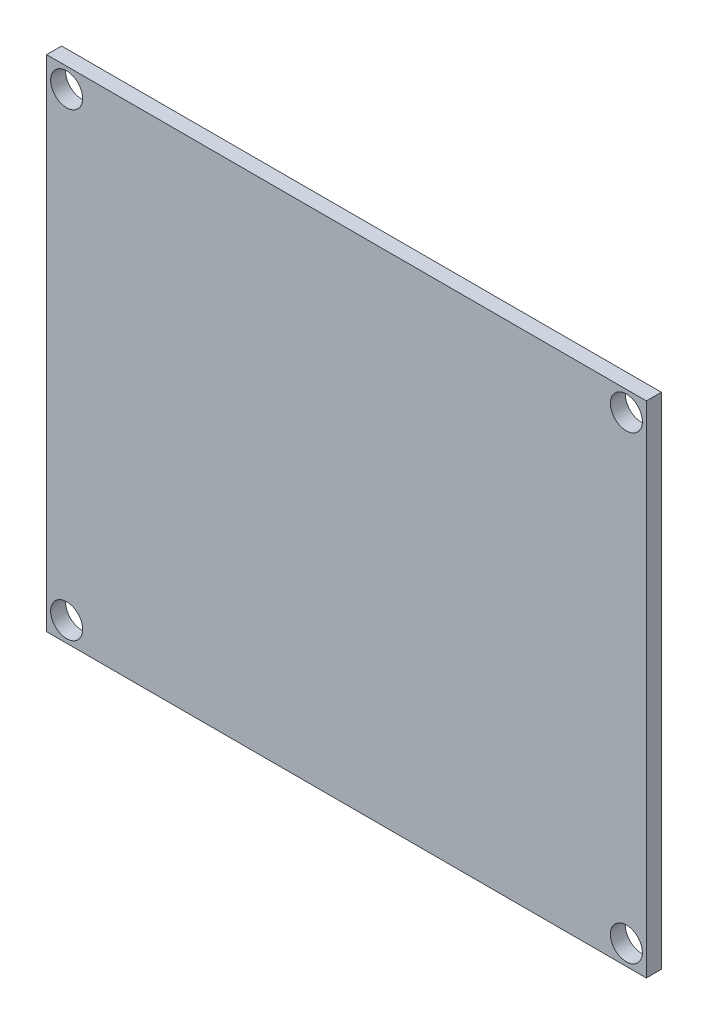
ISO-10303-21;
HEADER;
FILE_DESCRIPTION(('STEP AP214'),'2;1');
FILE_NAME('part.step','',(''),(''),'','','');
FILE_SCHEMA(('AUTOMOTIVE_DESIGN { 1 0 10303 214 1 1 1 1 }'));
ENDSEC;
DATA;
#1=APPLICATION_CONTEXT('core data for automotive mechanical design processes');
#2=APPLICATION_PROTOCOL_DEFINITION('international standard','automotive_design',2000,#1);
#3=PRODUCT_CONTEXT('',#1,'mechanical');
#4=PRODUCT('Part','Part','',(#3));
#5=PRODUCT_RELATED_PRODUCT_CATEGORY('part','',(#4));
#6=PRODUCT_DEFINITION_FORMATION('','',#4);
#7=PRODUCT_DEFINITION_CONTEXT('part definition',#1,'design');
#8=PRODUCT_DEFINITION('design','',#6,#7);
#9=PRODUCT_DEFINITION_SHAPE('','',#8);
#10=(LENGTH_UNIT() NAMED_UNIT(*) SI_UNIT(.MILLI.,.METRE.));
#11=(NAMED_UNIT(*) PLANE_ANGLE_UNIT() SI_UNIT($,.RADIAN.));
#12=(NAMED_UNIT(*) SI_UNIT($,.STERADIAN.) SOLID_ANGLE_UNIT());
#13=UNCERTAINTY_MEASURE_WITH_UNIT(LENGTH_MEASURE(1.E-05),#10,'distance_accuracy_value','');
#14=(GEOMETRIC_REPRESENTATION_CONTEXT(3) GLOBAL_UNCERTAINTY_ASSIGNED_CONTEXT((#13)) GLOBAL_UNIT_ASSIGNED_CONTEXT((#10,
#11,#12)) REPRESENTATION_CONTEXT('',''));
#15=CARTESIAN_POINT('',(0.,0.,0.));
#16=DIRECTION('',(0.,0.,1.));
#17=DIRECTION('',(1.,0.,0.));
#18=AXIS2_PLACEMENT_3D('',#15,#16,#17);
#19=CARTESIAN_POINT('',(0.,0.,1.5));
#20=DIRECTION('',(0.,0.,-1.));
#21=DIRECTION('',(-1.,0.,0.));
#22=AXIS2_PLACEMENT_3D('',#19,#20,#21);
#23=PLANE('',#22);
#24=DIRECTION('',(0.,1.,0.));
#25=VECTOR('',#24,1.);
#26=CARTESIAN_POINT('',(30.,-25.,1.5));
#27=LINE('',#26,#25);
#28=CARTESIAN_POINT('',(30.,-25.,1.5));
#29=VERTEX_POINT('',#28);
#30=CARTESIAN_POINT('',(30.,25.,1.5));
#31=VERTEX_POINT('',#30);
#32=EDGE_CURVE('E86',#29,#31,#27,.T.);
#33=ORIENTED_EDGE('',*,*,#32,.T.);
#34=DIRECTION('',(-1.,0.,0.));
#35=VECTOR('',#34,1.);
#36=CARTESIAN_POINT('',(-30.,25.,1.5));
#37=LINE('',#36,#35);
#38=CARTESIAN_POINT('',(-30.,25.,1.5));
#39=VERTEX_POINT('',#38);
#40=EDGE_CURVE('E81',#31,#39,#37,.T.);
#41=ORIENTED_EDGE('',*,*,#40,.T.);
#42=DIRECTION('',(0.,-1.,0.));
#43=VECTOR('',#42,1.);
#44=CARTESIAN_POINT('',(-30.,-25.,1.5));
#45=LINE('',#44,#43);
#46=CARTESIAN_POINT('',(-30.,-25.,1.5));
#47=VERTEX_POINT('',#46);
#48=EDGE_CURVE('E84',#39,#47,#45,.T.);
#49=ORIENTED_EDGE('',*,*,#48,.T.);
#50=DIRECTION('',(1.,0.,0.));
#51=VECTOR('',#50,1.);
#52=CARTESIAN_POINT('',(-30.,-25.,1.5));
#53=LINE('',#52,#51);
#54=EDGE_CURVE('E51',#47,#29,#53,.T.);
#55=ORIENTED_EDGE('',*,*,#54,.T.);
#56=EDGE_LOOP('',(#33,#41,#49,#55));
#57=FACE_BOUND('',#56,.T.);
#58=CARTESIAN_POINT('',(28.,23.,1.5));
#59=DIRECTION('',(0.,0.,1.));
#60=DIRECTION('',(1.,0.,0.));
#61=AXIS2_PLACEMENT_3D('',#58,#59,#60);
#62=CIRCLE('',#61,1.6);
#63=CARTESIAN_POINT('',(29.6,23.,1.5));
#64=VERTEX_POINT('',#63);
#65=EDGE_CURVE('E101',#64,#64,#62,.T.);
#66=ORIENTED_EDGE('',*,*,#65,.F.);
#67=EDGE_LOOP('',(#66));
#68=FACE_BOUND('',#67,.T.);
#69=CARTESIAN_POINT('',(28.,-23.,1.5));
#70=DIRECTION('',(0.,0.,1.));
#71=DIRECTION('',(1.,0.,0.));
#72=AXIS2_PLACEMENT_3D('',#69,#70,#71);
#73=CIRCLE('',#72,1.6);
#74=CARTESIAN_POINT('',(29.6,-23.,1.5));
#75=VERTEX_POINT('',#74);
#76=EDGE_CURVE('E116',#75,#75,#73,.T.);
#77=ORIENTED_EDGE('',*,*,#76,.F.);
#78=EDGE_LOOP('',(#77));
#79=FACE_BOUND('',#78,.T.);
#80=CARTESIAN_POINT('',(-28.,23.,1.5));
#81=DIRECTION('',(0.,0.,1.));
#82=DIRECTION('',(1.,0.,0.));
#83=AXIS2_PLACEMENT_3D('',#80,#81,#82);
#84=CIRCLE('',#83,1.6);
#85=CARTESIAN_POINT('',(-26.4,23.,1.5));
#86=VERTEX_POINT('',#85);
#87=EDGE_CURVE('E122',#86,#86,#84,.T.);
#88=ORIENTED_EDGE('',*,*,#87,.F.);
#89=EDGE_LOOP('',(#88));
#90=FACE_BOUND('',#89,.T.);
#91=CARTESIAN_POINT('',(-28.,-23.,1.5));
#92=DIRECTION('',(0.,0.,1.));
#93=DIRECTION('',(1.,0.,0.));
#94=AXIS2_PLACEMENT_3D('',#91,#92,#93);
#95=CIRCLE('',#94,1.6);
#96=CARTESIAN_POINT('',(-26.4,-23.,1.5));
#97=VERTEX_POINT('',#96);
#98=EDGE_CURVE('E128',#97,#97,#95,.T.);
#99=ORIENTED_EDGE('',*,*,#98,.F.);
#100=EDGE_LOOP('',(#99));
#101=FACE_BOUND('',#100,.T.);
#102=ADVANCED_FACE('F34',(#57,#68,#79,#90,#101),#23,.F.);
#103=CARTESIAN_POINT('',(0.,0.,0.));
#104=DIRECTION('',(0.,0.,-1.));
#105=DIRECTION('',(-1.,0.,0.));
#106=AXIS2_PLACEMENT_3D('',#103,#104,#105);
#107=PLANE('',#106);
#108=CARTESIAN_POINT('',(-28.,23.,0.));
#109=DIRECTION('',(0.,0.,1.));
#110=DIRECTION('',(1.,0.,0.));
#111=AXIS2_PLACEMENT_3D('',#108,#109,#110);
#112=CIRCLE('',#111,1.6);
#113=CARTESIAN_POINT('',(-26.4,23.,0.));
#114=VERTEX_POINT('',#113);
#115=EDGE_CURVE('E125',#114,#114,#112,.T.);
#116=ORIENTED_EDGE('',*,*,#115,.T.);
#117=EDGE_LOOP('',(#116));
#118=FACE_BOUND('',#117,.T.);
#119=CARTESIAN_POINT('',(28.,23.,0.));
#120=DIRECTION('',(0.,0.,1.));
#121=DIRECTION('',(1.,0.,0.));
#122=AXIS2_PLACEMENT_3D('',#119,#120,#121);
#123=CIRCLE('',#122,1.6);
#124=CARTESIAN_POINT('',(29.6,23.,0.));
#125=VERTEX_POINT('',#124);
#126=EDGE_CURVE('E113',#125,#125,#123,.T.);
#127=ORIENTED_EDGE('',*,*,#126,.T.);
#128=EDGE_LOOP('',(#127));
#129=FACE_BOUND('',#128,.T.);
#130=DIRECTION('',(0.,1.,0.));
#131=VECTOR('',#130,1.);
#132=CARTESIAN_POINT('',(30.,-25.,0.));
#133=LINE('',#132,#131);
#134=CARTESIAN_POINT('',(30.,-25.,0.));
#135=VERTEX_POINT('',#134);
#136=CARTESIAN_POINT('',(30.,25.,0.));
#137=VERTEX_POINT('',#136);
#138=EDGE_CURVE('E98',#135,#137,#133,.T.);
#139=ORIENTED_EDGE('',*,*,#138,.F.);
#140=DIRECTION('',(1.,0.,0.));
#141=VECTOR('',#140,1.);
#142=CARTESIAN_POINT('',(-30.,-25.,0.));
#143=LINE('',#142,#141);
#144=CARTESIAN_POINT('',(-30.,-25.,0.));
#145=VERTEX_POINT('',#144);
#146=EDGE_CURVE('E74',#145,#135,#143,.T.);
#147=ORIENTED_EDGE('',*,*,#146,.F.);
#148=DIRECTION('',(0.,-1.,0.));
#149=VECTOR('',#148,1.);
#150=CARTESIAN_POINT('',(-30.,-25.,0.));
#151=LINE('',#150,#149);
#152=CARTESIAN_POINT('',(-30.,25.,0.));
#153=VERTEX_POINT('',#152);
#154=EDGE_CURVE('E68',#153,#145,#151,.T.);
#155=ORIENTED_EDGE('',*,*,#154,.F.);
#156=DIRECTION('',(-1.,0.,0.));
#157=VECTOR('',#156,1.);
#158=CARTESIAN_POINT('',(-30.,25.,0.));
#159=LINE('',#158,#157);
#160=EDGE_CURVE('E90',#137,#153,#159,.T.);
#161=ORIENTED_EDGE('',*,*,#160,.F.);
#162=EDGE_LOOP('',(#139,#147,#155,#161));
#163=FACE_BOUND('',#162,.T.);
#164=CARTESIAN_POINT('',(28.,-23.,0.));
#165=DIRECTION('',(0.,0.,1.));
#166=DIRECTION('',(1.,0.,0.));
#167=AXIS2_PLACEMENT_3D('',#164,#165,#166);
#168=CIRCLE('',#167,1.6);
#169=CARTESIAN_POINT('',(29.6,-23.,0.));
#170=VERTEX_POINT('',#169);
#171=EDGE_CURVE('E119',#170,#170,#168,.T.);
#172=ORIENTED_EDGE('',*,*,#171,.T.);
#173=EDGE_LOOP('',(#172));
#174=FACE_BOUND('',#173,.T.);
#175=CARTESIAN_POINT('',(-28.,-23.,0.));
#176=DIRECTION('',(0.,0.,1.));
#177=DIRECTION('',(1.,0.,0.));
#178=AXIS2_PLACEMENT_3D('',#175,#176,#177);
#179=CIRCLE('',#178,1.6);
#180=CARTESIAN_POINT('',(-26.4,-23.,0.));
#181=VERTEX_POINT('',#180);
#182=EDGE_CURVE('E131',#181,#181,#179,.T.);
#183=ORIENTED_EDGE('',*,*,#182,.T.);
#184=EDGE_LOOP('',(#183));
#185=FACE_BOUND('',#184,.T.);
#186=ADVANCED_FACE('F109',(#118,#129,#163,#174,#185),#107,.T.);
#187=CARTESIAN_POINT('',(30.,-25.,1.5));
#188=DIRECTION('',(-1.,0.,0.));
#189=DIRECTION('',(0.,0.,1.));
#190=AXIS2_PLACEMENT_3D('',#187,#188,#189);
#191=PLANE('',#190);
#192=ORIENTED_EDGE('',*,*,#138,.T.);
#193=DIRECTION('',(0.,0.,-1.));
#194=VECTOR('',#193,1.);
#195=CARTESIAN_POINT('',(30.,25.,1.5));
#196=LINE('',#195,#194);
#197=EDGE_CURVE('E11',#31,#137,#196,.T.);
#198=ORIENTED_EDGE('',*,*,#197,.F.);
#199=ORIENTED_EDGE('',*,*,#32,.F.);
#200=DIRECTION('',(0.,0.,-1.));
#201=VECTOR('',#200,1.);
#202=CARTESIAN_POINT('',(30.,-25.,1.5));
#203=LINE('',#202,#201);
#204=EDGE_CURVE('E94',#29,#135,#203,.T.);
#205=ORIENTED_EDGE('',*,*,#204,.T.);
#206=EDGE_LOOP('',(#192,#198,#199,#205));
#207=FACE_BOUND('',#206,.T.);
#208=ADVANCED_FACE('F36',(#207),#191,.F.);
#209=CARTESIAN_POINT('',(-30.,25.,1.5));
#210=DIRECTION('',(0.,-1.,0.));
#211=DIRECTION('',(0.,0.,-1.));
#212=AXIS2_PLACEMENT_3D('',#209,#210,#211);
#213=PLANE('',#212);
#214=ORIENTED_EDGE('',*,*,#160,.T.);
#215=DIRECTION('',(0.,0.,-1.));
#216=VECTOR('',#215,1.);
#217=CARTESIAN_POINT('',(-30.,25.,1.5));
#218=LINE('',#217,#216);
#219=EDGE_CURVE('E43',#39,#153,#218,.T.);
#220=ORIENTED_EDGE('',*,*,#219,.F.);
#221=ORIENTED_EDGE('',*,*,#40,.F.);
#222=ORIENTED_EDGE('',*,*,#197,.T.);
#223=EDGE_LOOP('',(#214,#220,#221,#222));
#224=FACE_BOUND('',#223,.T.);
#225=ADVANCED_FACE('F89',(#224),#213,.F.);
#226=CARTESIAN_POINT('',(-30.,-25.,1.5));
#227=DIRECTION('',(1.,0.,0.));
#228=DIRECTION('',(0.,0.,-1.));
#229=AXIS2_PLACEMENT_3D('',#226,#227,#228);
#230=PLANE('',#229);
#231=ORIENTED_EDGE('',*,*,#154,.T.);
#232=DIRECTION('',(0.,0.,-1.));
#233=VECTOR('',#232,1.);
#234=CARTESIAN_POINT('',(-30.,-25.,1.5));
#235=LINE('',#234,#233);
#236=EDGE_CURVE('E91',#47,#145,#235,.T.);
#237=ORIENTED_EDGE('',*,*,#236,.F.);
#238=ORIENTED_EDGE('',*,*,#48,.F.);
#239=ORIENTED_EDGE('',*,*,#219,.T.);
#240=EDGE_LOOP('',(#231,#237,#238,#239));
#241=FACE_BOUND('',#240,.T.);
#242=ADVANCED_FACE('F92',(#241),#230,.F.);
#243=CARTESIAN_POINT('',(-30.,-25.,1.5));
#244=DIRECTION('',(0.,1.,0.));
#245=DIRECTION('',(0.,0.,1.));
#246=AXIS2_PLACEMENT_3D('',#243,#244,#245);
#247=PLANE('',#246);
#248=ORIENTED_EDGE('',*,*,#146,.T.);
#249=ORIENTED_EDGE('',*,*,#204,.F.);
#250=ORIENTED_EDGE('',*,*,#54,.F.);
#251=ORIENTED_EDGE('',*,*,#236,.T.);
#252=EDGE_LOOP('',(#248,#249,#250,#251));
#253=FACE_BOUND('',#252,.T.);
#254=ADVANCED_FACE('F106',(#253),#247,.F.);
#255=CARTESIAN_POINT('',(28.,23.,1.5));
#256=DIRECTION('',(0.,0.,-1.));
#257=DIRECTION('',(-1.,0.,0.));
#258=AXIS2_PLACEMENT_3D('',#255,#256,#257);
#259=CYLINDRICAL_SURFACE('',#258,1.6);
#260=ORIENTED_EDGE('',*,*,#65,.T.);
#261=EDGE_LOOP('',(#260));
#262=FACE_BOUND('',#261,.T.);
#263=ORIENTED_EDGE('',*,*,#126,.F.);
#264=EDGE_LOOP('',(#263));
#265=FACE_BOUND('',#264,.T.);
#266=ADVANCED_FACE('F148',(#262,#265),#259,.F.);
#267=CARTESIAN_POINT('',(28.,-23.,1.5));
#268=DIRECTION('',(0.,0.,-1.));
#269=DIRECTION('',(-1.,0.,0.));
#270=AXIS2_PLACEMENT_3D('',#267,#268,#269);
#271=CYLINDRICAL_SURFACE('',#270,1.6);
#272=ORIENTED_EDGE('',*,*,#76,.T.);
#273=EDGE_LOOP('',(#272));
#274=FACE_BOUND('',#273,.T.);
#275=ORIENTED_EDGE('',*,*,#171,.F.);
#276=EDGE_LOOP('',(#275));
#277=FACE_BOUND('',#276,.T.);
#278=ADVANCED_FACE('F194',(#274,#277),#271,.F.);
#279=CARTESIAN_POINT('',(-28.,23.,1.5));
#280=DIRECTION('',(0.,0.,-1.));
#281=DIRECTION('',(-1.,0.,0.));
#282=AXIS2_PLACEMENT_3D('',#279,#280,#281);
#283=CYLINDRICAL_SURFACE('',#282,1.6);
#284=ORIENTED_EDGE('',*,*,#87,.T.);
#285=EDGE_LOOP('',(#284));
#286=FACE_BOUND('',#285,.T.);
#287=ORIENTED_EDGE('',*,*,#115,.F.);
#288=EDGE_LOOP('',(#287));
#289=FACE_BOUND('',#288,.T.);
#290=ADVANCED_FACE('F202',(#286,#289),#283,.F.);
#291=CARTESIAN_POINT('',(-28.,-23.,1.5));
#292=DIRECTION('',(0.,0.,-1.));
#293=DIRECTION('',(-1.,0.,0.));
#294=AXIS2_PLACEMENT_3D('',#291,#292,#293);
#295=CYLINDRICAL_SURFACE('',#294,1.6);
#296=ORIENTED_EDGE('',*,*,#98,.T.);
#297=EDGE_LOOP('',(#296));
#298=FACE_BOUND('',#297,.T.);
#299=ORIENTED_EDGE('',*,*,#182,.F.);
#300=EDGE_LOOP('',(#299));
#301=FACE_BOUND('',#300,.T.);
#302=ADVANCED_FACE('F137',(#298,#301),#295,.F.);
#303=CLOSED_SHELL('',(#102,#186,#208,#225,#242,#254,#266,#278,#290,#302));
#304=MANIFOLD_SOLID_BREP('B2',#303);
#305=ADVANCED_BREP_SHAPE_REPRESENTATION('',(#18,#304),#14);
#306=SHAPE_DEFINITION_REPRESENTATION(#9,#305);
ENDSEC;
END-ISO-10303-21;
